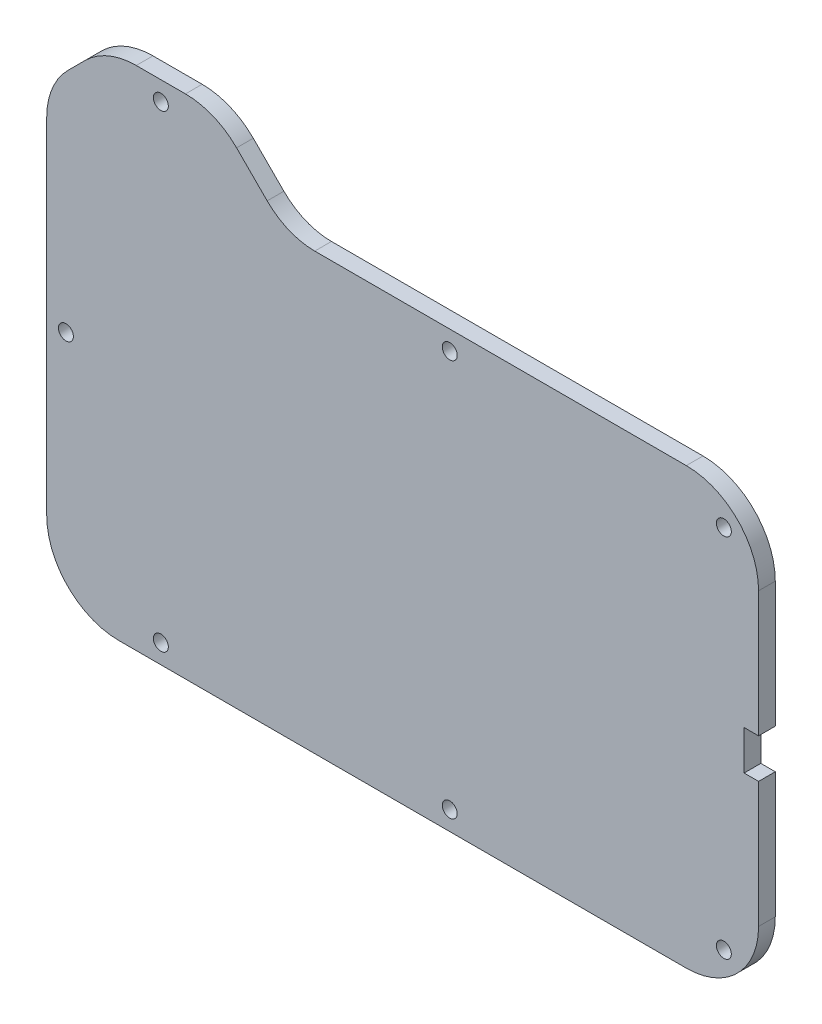
ISO-10303-21;
HEADER;
FILE_DESCRIPTION(('STEP AP214'),'2;1');
FILE_NAME('part.step','',(''),(''),'','','');
FILE_SCHEMA(('AUTOMOTIVE_DESIGN { 1 0 10303 214 1 1 1 1 }'));
ENDSEC;
DATA;
#1=APPLICATION_CONTEXT('core data for automotive mechanical design processes');
#2=APPLICATION_PROTOCOL_DEFINITION('international standard','automotive_design',2000,#1);
#3=PRODUCT_CONTEXT('',#1,'mechanical');
#4=PRODUCT('Part','Part','',(#3));
#5=PRODUCT_RELATED_PRODUCT_CATEGORY('part','',(#4));
#6=PRODUCT_DEFINITION_FORMATION('','',#4);
#7=PRODUCT_DEFINITION_CONTEXT('part definition',#1,'design');
#8=PRODUCT_DEFINITION('design','',#6,#7);
#9=PRODUCT_DEFINITION_SHAPE('','',#8);
#10=(LENGTH_UNIT() NAMED_UNIT(*) SI_UNIT(.MILLI.,.METRE.));
#11=(NAMED_UNIT(*) PLANE_ANGLE_UNIT() SI_UNIT($,.RADIAN.));
#12=(NAMED_UNIT(*) SI_UNIT($,.STERADIAN.) SOLID_ANGLE_UNIT());
#13=UNCERTAINTY_MEASURE_WITH_UNIT(LENGTH_MEASURE(1.E-05),#10,'distance_accuracy_value','');
#14=(GEOMETRIC_REPRESENTATION_CONTEXT(3) GLOBAL_UNCERTAINTY_ASSIGNED_CONTEXT((#13)) GLOBAL_UNIT_ASSIGNED_CONTEXT((#10,
#11,#12)) REPRESENTATION_CONTEXT('',''));
#15=CARTESIAN_POINT('',(0.,0.,0.));
#16=DIRECTION('',(0.,0.,1.));
#17=DIRECTION('',(1.,0.,0.));
#18=AXIS2_PLACEMENT_3D('',#15,#16,#17);
#19=CARTESIAN_POINT('',(130.058069079206,20.4605017386257,3.175));
#20=DIRECTION('',(0.,0.,1.));
#21=DIRECTION('',(1.,0.,0.));
#22=AXIS2_PLACEMENT_3D('',#19,#20,#21);
#23=PLANE('',#22);
#24=CARTESIAN_POINT('',(85.0537427985491,10.3605017396949,3.175));
#25=DIRECTION('',(0.,0.,1.));
#26=DIRECTION('',(1.,0.,0.));
#27=AXIS2_PLACEMENT_3D('',#24,#25,#26);
#28=CIRCLE('',#27,1.425);
#29=CARTESIAN_POINT('',(86.4787427985491,10.3605017396949,3.175));
#30=VERTEX_POINT('',#29);
#31=EDGE_CURVE('E383',#30,#30,#28,.T.);
#32=ORIENTED_EDGE('',*,*,#31,.F.);
#33=EDGE_LOOP('',(#32));
#34=FACE_BOUND('',#33,.T.);
#35=CARTESIAN_POINT('',(137.199847569466,82.9022802294033,3.175));
#36=DIRECTION('',(0.,0.,1.));
#37=DIRECTION('',(1.,0.,0.));
#38=AXIS2_PLACEMENT_3D('',#35,#36,#37);
#39=CIRCLE('',#38,1.42500000000002);
#40=CARTESIAN_POINT('',(138.624847569466,82.9022802294033,3.175));
#41=VERTEX_POINT('',#40);
#42=EDGE_CURVE('E395',#41,#41,#39,.T.);
#43=ORIENTED_EDGE('',*,*,#42,.F.);
#44=EDGE_LOOP('',(#43));
#45=FACE_BOUND('',#44,.T.);
#46=CARTESIAN_POINT('',(30.0963119397805,99.4605017396949,3.175));
#47=DIRECTION('',(0.,0.,1.));
#48=DIRECTION('',(1.,0.,0.));
#49=AXIS2_PLACEMENT_3D('',#46,#47,#48);
#50=CIRCLE('',#49,1.425);
#51=CARTESIAN_POINT('',(31.5213119397805,99.4605017396949,3.175));
#52=VERTEX_POINT('',#51);
#53=EDGE_CURVE('E407',#52,#52,#50,.T.);
#54=ORIENTED_EDGE('',*,*,#53,.F.);
#55=EDGE_LOOP('',(#54));
#56=FACE_BOUND('',#55,.T.);
#57=CARTESIAN_POINT('',(130.058069079206,20.4605017386257,3.175));
#58=DIRECTION('',(0.,0.,1.));
#59=DIRECTION('',(1.,0.,0.));
#60=AXIS2_PLACEMENT_3D('',#57,#58,#59);
#61=CIRCLE('',#60,13.75);
#62=CARTESIAN_POINT('',(130.058069079206,6.71050173862571,3.175));
#63=VERTEX_POINT('',#62);
#64=CARTESIAN_POINT('',(143.808069079206,20.4605017386257,3.175));
#65=VERTEX_POINT('',#64);
#66=EDGE_CURVE('E227',#63,#65,#61,.T.);
#67=ORIENTED_EDGE('',*,*,#66,.T.);
#68=DIRECTION('',(0.,1.,0.));
#69=VECTOR('',#68,1.);
#70=CARTESIAN_POINT('',(143.808069079206,20.4605017386257,3.175));
#71=LINE('',#70,#69);
#72=CARTESIAN_POINT('',(143.808069079206,44.3605017391603,3.175));
#73=VERTEX_POINT('',#72);
#74=EDGE_CURVE('E125',#65,#73,#71,.T.);
#75=ORIENTED_EDGE('',*,*,#74,.T.);
#76=DIRECTION('',(-1.,0.,0.));
#77=VECTOR('',#76,1.);
#78=CARTESIAN_POINT('',(141.058069079206,44.3605017391603,3.175));
#79=LINE('',#78,#77);
#80=CARTESIAN_POINT('',(141.058069079206,44.3605017391603,3.175));
#81=VERTEX_POINT('',#80);
#82=EDGE_CURVE('E272',#73,#81,#79,.T.);
#83=ORIENTED_EDGE('',*,*,#82,.T.);
#84=DIRECTION('',(0.,1.,0.));
#85=VECTOR('',#84,1.);
#86=CARTESIAN_POINT('',(141.058069079206,44.3605017391603,3.175));
#87=LINE('',#86,#85);
#88=CARTESIAN_POINT('',(141.058069079206,51.8605017391603,3.175));
#89=VERTEX_POINT('',#88);
#90=EDGE_CURVE('E291',#81,#89,#87,.T.);
#91=ORIENTED_EDGE('',*,*,#90,.T.);
#92=DIRECTION('',(1.,0.,0.));
#93=VECTOR('',#92,1.);
#94=CARTESIAN_POINT('',(141.058069079206,51.8605017391603,3.175));
#95=LINE('',#94,#93);
#96=CARTESIAN_POINT('',(143.808069079206,51.8605017391603,3.175));
#97=VERTEX_POINT('',#96);
#98=EDGE_CURVE('E288',#89,#97,#95,.T.);
#99=ORIENTED_EDGE('',*,*,#98,.T.);
#100=DIRECTION('',(0.,1.,0.));
#101=VECTOR('',#100,1.);
#102=CARTESIAN_POINT('',(143.808069079206,51.8605017391603,3.175));
#103=LINE('',#102,#101);
#104=CARTESIAN_POINT('',(143.808069079206,75.7605017396949,3.175));
#105=VERTEX_POINT('',#104);
#106=EDGE_CURVE('E290',#97,#105,#103,.T.);
#107=ORIENTED_EDGE('',*,*,#106,.T.);
#108=CARTESIAN_POINT('',(130.058069079206,75.7605017396949,3.175));
#109=DIRECTION('',(0.,0.,1.));
#110=DIRECTION('',(1.,0.,0.));
#111=AXIS2_PLACEMENT_3D('',#108,#109,#110);
#112=CIRCLE('',#111,13.75);
#113=CARTESIAN_POINT('',(130.058069079206,89.5105017396949,3.175));
#114=VERTEX_POINT('',#113);
#115=EDGE_CURVE('E293',#105,#114,#112,.T.);
#116=ORIENTED_EDGE('',*,*,#115,.T.);
#117=DIRECTION('',(-1.,0.,0.));
#118=VECTOR('',#117,1.);
#119=CARTESIAN_POINT('',(130.058069079206,89.5105017396948,3.175));
#120=LINE('',#119,#118);
#121=CARTESIAN_POINT('',(59.3751830391429,89.5105017396948,3.175));
#122=VERTEX_POINT('',#121);
#123=EDGE_CURVE('E299',#114,#122,#120,.T.);
#124=ORIENTED_EDGE('',*,*,#123,.T.);
#125=CARTESIAN_POINT('',(59.3751830391429,102.310501739695,3.175));
#126=DIRECTION('',(0.,0.,-1.));
#127=DIRECTION('',(1.,0.,0.));
#128=AXIS2_PLACEMENT_3D('',#125,#126,#127);
#129=CIRCLE('',#128,12.8);
#130=CARTESIAN_POINT('',(50.3242162399551,93.2595349405071,3.175));
#131=VERTEX_POINT('',#130);
#132=EDGE_CURVE('E301',#122,#131,#129,.T.);
#133=ORIENTED_EDGE('',*,*,#132,.T.);
#134=DIRECTION('',(-0.707106781186548,0.707106781186548,0.));
#135=VECTOR('',#134,1.);
#136=CARTESIAN_POINT('',(50.3242162399551,93.2595349405071,3.175));
#137=LINE('',#136,#135);
#138=CARTESIAN_POINT('',(44.5005311994522,99.0832199810099,3.175));
#139=VERTEX_POINT('',#138);
#140=EDGE_CURVE('E303',#131,#139,#137,.T.);
#141=ORIENTED_EDGE('',*,*,#140,.T.);
#142=CARTESIAN_POINT('',(34.7778129581372,89.3605017396949,3.175));
#143=DIRECTION('',(0.,0.,1.));
#144=DIRECTION('',(1.,0.,0.));
#145=AXIS2_PLACEMENT_3D('',#142,#143,#144);
#146=CIRCLE('',#145,13.75);
#147=CARTESIAN_POINT('',(34.7778129581371,103.110501739695,3.175));
#148=VERTEX_POINT('',#147);
#149=EDGE_CURVE('E305',#139,#148,#146,.T.);
#150=ORIENTED_EDGE('',*,*,#149,.T.);
#151=DIRECTION('',(-1.,0.,0.));
#152=VECTOR('',#151,1.);
#153=CARTESIAN_POINT('',(34.7778129581371,103.110501739695,3.175));
#154=LINE('',#153,#152);
#155=CARTESIAN_POINT('',(25.4148109214239,103.110501739695,3.175));
#156=VERTEX_POINT('',#155);
#157=EDGE_CURVE('E307',#148,#156,#154,.T.);
#158=ORIENTED_EDGE('',*,*,#157,.T.);
#159=CARTESIAN_POINT('',(25.4148109214239,89.3605017396949,3.175));
#160=DIRECTION('',(0.,0.,1.));
#161=DIRECTION('',(1.,0.,0.));
#162=AXIS2_PLACEMENT_3D('',#159,#160,#161);
#163=CIRCLE('',#162,13.75);
#164=CARTESIAN_POINT('',(15.6920926801088,99.0832199810099,3.175));
#165=VERTEX_POINT('',#164);
#166=EDGE_CURVE('E309',#156,#165,#163,.T.);
#167=ORIENTED_EDGE('',*,*,#166,.T.);
#168=DIRECTION('',(-0.707106781186548,-0.707106781186548,0.));
#169=VECTOR('',#168,1.);
#170=CARTESIAN_POINT('',(15.6920926801088,99.0832199810099,3.175));
#171=LINE('',#170,#169);
#172=CARTESIAN_POINT('',(12.4118365590397,95.8029638599407,3.175));
#173=VERTEX_POINT('',#172);
#174=EDGE_CURVE('E311',#165,#173,#171,.T.);
#175=ORIENTED_EDGE('',*,*,#174,.T.);
#176=CARTESIAN_POINT('',(22.1345548003547,86.0802456186257,3.175));
#177=DIRECTION('',(0.,0.,1.));
#178=DIRECTION('',(1.,0.,0.));
#179=AXIS2_PLACEMENT_3D('',#176,#177,#178);
#180=CIRCLE('',#179,13.75);
#181=CARTESIAN_POINT('',(8.38455480035474,86.0802456186257,3.175));
#182=VERTEX_POINT('',#181);
#183=EDGE_CURVE('E174',#173,#182,#180,.T.);
#184=ORIENTED_EDGE('',*,*,#183,.T.);
#185=DIRECTION('',(0.,-1.,0.));
#186=VECTOR('',#185,1.);
#187=CARTESIAN_POINT('',(8.38455480035474,86.0802456186257,3.175));
#188=LINE('',#187,#186);
#189=CARTESIAN_POINT('',(8.38455480035472,20.4605017386257,3.175));
#190=VERTEX_POINT('',#189);
#191=EDGE_CURVE('E168',#182,#190,#188,.T.);
#192=ORIENTED_EDGE('',*,*,#191,.T.);
#193=CARTESIAN_POINT('',(22.1345548003547,20.4605017386257,3.175));
#194=DIRECTION('',(0.,0.,1.));
#195=DIRECTION('',(1.,0.,0.));
#196=AXIS2_PLACEMENT_3D('',#193,#194,#195);
#197=CIRCLE('',#196,13.75);
#198=CARTESIAN_POINT('',(22.1345548003547,6.7105017386257,3.175));
#199=VERTEX_POINT('',#198);
#200=EDGE_CURVE('E172',#190,#199,#197,.T.);
#201=ORIENTED_EDGE('',*,*,#200,.T.);
#202=DIRECTION('',(1.,0.,0.));
#203=VECTOR('',#202,1.);
#204=CARTESIAN_POINT('',(22.1345548003547,6.71050173862571,3.175));
#205=LINE('',#204,#203);
#206=EDGE_CURVE('E52',#199,#63,#205,.T.);
#207=ORIENTED_EDGE('',*,*,#206,.T.);
#208=EDGE_LOOP('',(#67,#75,#83,#91,#99,#107,#116,#124,#133,#141,#150,#158,#167,#175,#184,#192,
#201,#207));
#209=FACE_BOUND('',#208,.T.);
#210=CARTESIAN_POINT('',(12.0345548003547,52.4703736791603,3.175));
#211=DIRECTION('',(0.,0.,1.));
#212=DIRECTION('',(1.,0.,0.));
#213=AXIS2_PLACEMENT_3D('',#210,#211,#212);
#214=CIRCLE('',#213,1.425);
#215=CARTESIAN_POINT('',(13.4595548003547,52.4703736791603,3.175));
#216=VERTEX_POINT('',#215);
#217=EDGE_CURVE('E196',#216,#216,#214,.T.);
#218=ORIENTED_EDGE('',*,*,#217,.F.);
#219=EDGE_LOOP('',(#218));
#220=FACE_BOUND('',#219,.T.);
#221=CARTESIAN_POINT('',(85.0537427985491,85.8605017396949,3.175));
#222=DIRECTION('',(0.,0.,1.));
#223=DIRECTION('',(1.,0.,0.));
#224=AXIS2_PLACEMENT_3D('',#221,#222,#223);
#225=CIRCLE('',#224,1.425);
#226=CARTESIAN_POINT('',(86.4787427985491,85.8605017396949,3.175));
#227=VERTEX_POINT('',#226);
#228=EDGE_CURVE('E401',#227,#227,#225,.T.);
#229=ORIENTED_EDGE('',*,*,#228,.F.);
#230=EDGE_LOOP('',(#229));
#231=FACE_BOUND('',#230,.T.);
#232=CARTESIAN_POINT('',(137.199847569458,13.3187232494434,3.175));
#233=DIRECTION('',(0.,0.,1.));
#234=DIRECTION('',(1.,0.,0.));
#235=AXIS2_PLACEMENT_3D('',#232,#233,#234);
#236=CIRCLE('',#235,1.42500000000002);
#237=CARTESIAN_POINT('',(138.624847569458,13.3187232494434,3.175));
#238=VERTEX_POINT('',#237);
#239=EDGE_CURVE('E389',#238,#238,#236,.T.);
#240=ORIENTED_EDGE('',*,*,#239,.F.);
#241=EDGE_LOOP('',(#240));
#242=FACE_BOUND('',#241,.T.);
#243=CARTESIAN_POINT('',(30.0963119397805,10.3605017396949,3.175));
#244=DIRECTION('',(0.,0.,1.));
#245=DIRECTION('',(1.,0.,0.));
#246=AXIS2_PLACEMENT_3D('',#243,#244,#245);
#247=CIRCLE('',#246,1.425);
#248=CARTESIAN_POINT('',(31.5213119397805,10.3605017396949,3.175));
#249=VERTEX_POINT('',#248);
#250=EDGE_CURVE('E374',#249,#249,#247,.T.);
#251=ORIENTED_EDGE('',*,*,#250,.F.);
#252=EDGE_LOOP('',(#251));
#253=FACE_BOUND('',#252,.T.);
#254=ADVANCED_FACE('F35',(#34,#45,#56,#209,#220,#231,#242,#253),#23,.T.);
#255=CARTESIAN_POINT('',(130.058069079206,20.4605017386257,0.));
#256=DIRECTION('',(0.,0.,1.));
#257=DIRECTION('',(1.,0.,0.));
#258=AXIS2_PLACEMENT_3D('',#255,#256,#257);
#259=PLANE('',#258);
#260=CARTESIAN_POINT('',(130.058069079206,20.4605017386257,0.));
#261=DIRECTION('',(0.,0.,1.));
#262=DIRECTION('',(1.,0.,0.));
#263=AXIS2_PLACEMENT_3D('',#260,#261,#262);
#264=CIRCLE('',#263,13.75);
#265=CARTESIAN_POINT('',(130.058069079206,6.71050173862571,0.));
#266=VERTEX_POINT('',#265);
#267=CARTESIAN_POINT('',(143.808069079206,20.4605017386257,0.));
#268=VERTEX_POINT('',#267);
#269=EDGE_CURVE('E192',#266,#268,#264,.T.);
#270=ORIENTED_EDGE('',*,*,#269,.F.);
#271=DIRECTION('',(1.,0.,0.));
#272=VECTOR('',#271,1.);
#273=CARTESIAN_POINT('',(22.1345548003547,6.71050173862571,0.));
#274=LINE('',#273,#272);
#275=CARTESIAN_POINT('',(22.1345548003547,6.7105017386257,0.));
#276=VERTEX_POINT('',#275);
#277=EDGE_CURVE('E117',#276,#266,#274,.T.);
#278=ORIENTED_EDGE('',*,*,#277,.F.);
#279=CARTESIAN_POINT('',(22.1345548003547,20.4605017386257,0.));
#280=DIRECTION('',(0.,0.,1.));
#281=DIRECTION('',(1.,0.,0.));
#282=AXIS2_PLACEMENT_3D('',#279,#280,#281);
#283=CIRCLE('',#282,13.75);
#284=CARTESIAN_POINT('',(8.38455480035472,20.4605017386257,0.));
#285=VERTEX_POINT('',#284);
#286=EDGE_CURVE('E111',#285,#276,#283,.T.);
#287=ORIENTED_EDGE('',*,*,#286,.F.);
#288=DIRECTION('',(0.,-1.,0.));
#289=VECTOR('',#288,1.);
#290=CARTESIAN_POINT('',(8.38455480035474,86.0802456186257,0.));
#291=LINE('',#290,#289);
#292=CARTESIAN_POINT('',(8.38455480035474,86.0802456186257,0.));
#293=VERTEX_POINT('',#292);
#294=EDGE_CURVE('E182',#293,#285,#291,.T.);
#295=ORIENTED_EDGE('',*,*,#294,.F.);
#296=CARTESIAN_POINT('',(22.1345548003547,86.0802456186257,0.));
#297=DIRECTION('',(0.,0.,1.));
#298=DIRECTION('',(1.,0.,0.));
#299=AXIS2_PLACEMENT_3D('',#296,#297,#298);
#300=CIRCLE('',#299,13.75);
#301=CARTESIAN_POINT('',(12.4118365590397,95.8029638599407,0.));
#302=VERTEX_POINT('',#301);
#303=EDGE_CURVE('E222',#302,#293,#300,.T.);
#304=ORIENTED_EDGE('',*,*,#303,.F.);
#305=DIRECTION('',(-0.707106781186548,-0.707106781186548,0.));
#306=VECTOR('',#305,1.);
#307=CARTESIAN_POINT('',(15.6920926801088,99.0832199810099,0.));
#308=LINE('',#307,#306);
#309=CARTESIAN_POINT('',(15.6920926801088,99.0832199810099,0.));
#310=VERTEX_POINT('',#309);
#311=EDGE_CURVE('E220',#310,#302,#308,.T.);
#312=ORIENTED_EDGE('',*,*,#311,.F.);
#313=CARTESIAN_POINT('',(25.4148109214239,89.3605017396949,0.));
#314=DIRECTION('',(0.,0.,1.));
#315=DIRECTION('',(1.,0.,0.));
#316=AXIS2_PLACEMENT_3D('',#313,#314,#315);
#317=CIRCLE('',#316,13.75);
#318=CARTESIAN_POINT('',(25.4148109214239,103.110501739695,0.));
#319=VERTEX_POINT('',#318);
#320=EDGE_CURVE('E218',#319,#310,#317,.T.);
#321=ORIENTED_EDGE('',*,*,#320,.F.);
#322=DIRECTION('',(-1.,0.,0.));
#323=VECTOR('',#322,1.);
#324=CARTESIAN_POINT('',(34.7778129581371,103.110501739695,0.));
#325=LINE('',#324,#323);
#326=CARTESIAN_POINT('',(34.7778129581371,103.110501739695,0.));
#327=VERTEX_POINT('',#326);
#328=EDGE_CURVE('E216',#327,#319,#325,.T.);
#329=ORIENTED_EDGE('',*,*,#328,.F.);
#330=CARTESIAN_POINT('',(34.7778129581372,89.3605017396949,0.));
#331=DIRECTION('',(0.,0.,1.));
#332=DIRECTION('',(1.,0.,0.));
#333=AXIS2_PLACEMENT_3D('',#330,#331,#332);
#334=CIRCLE('',#333,13.75);
#335=CARTESIAN_POINT('',(44.5005311994522,99.0832199810099,0.));
#336=VERTEX_POINT('',#335);
#337=EDGE_CURVE('E214',#336,#327,#334,.T.);
#338=ORIENTED_EDGE('',*,*,#337,.F.);
#339=DIRECTION('',(-0.707106781186548,0.707106781186548,0.));
#340=VECTOR('',#339,1.);
#341=CARTESIAN_POINT('',(50.3242162399551,93.2595349405071,0.));
#342=LINE('',#341,#340);
#343=CARTESIAN_POINT('',(50.3242162399551,93.2595349405071,0.));
#344=VERTEX_POINT('',#343);
#345=EDGE_CURVE('E212',#344,#336,#342,.T.);
#346=ORIENTED_EDGE('',*,*,#345,.F.);
#347=CARTESIAN_POINT('',(59.3751830391429,102.310501739695,0.));
#348=DIRECTION('',(0.,0.,-1.));
#349=DIRECTION('',(1.,0.,0.));
#350=AXIS2_PLACEMENT_3D('',#347,#348,#349);
#351=CIRCLE('',#350,12.8);
#352=CARTESIAN_POINT('',(59.3751830391429,89.5105017396948,0.));
#353=VERTEX_POINT('',#352);
#354=EDGE_CURVE('E210',#353,#344,#351,.T.);
#355=ORIENTED_EDGE('',*,*,#354,.F.);
#356=DIRECTION('',(-1.,0.,0.));
#357=VECTOR('',#356,1.);
#358=CARTESIAN_POINT('',(130.058069079206,89.5105017396948,0.));
#359=LINE('',#358,#357);
#360=CARTESIAN_POINT('',(130.058069079206,89.5105017396949,0.));
#361=VERTEX_POINT('',#360);
#362=EDGE_CURVE('E208',#361,#353,#359,.T.);
#363=ORIENTED_EDGE('',*,*,#362,.F.);
#364=CARTESIAN_POINT('',(130.058069079206,75.7605017396949,0.));
#365=DIRECTION('',(0.,0.,1.));
#366=DIRECTION('',(1.,0.,0.));
#367=AXIS2_PLACEMENT_3D('',#364,#365,#366);
#368=CIRCLE('',#367,13.75);
#369=CARTESIAN_POINT('',(143.808069079206,75.7605017396949,0.));
#370=VERTEX_POINT('',#369);
#371=EDGE_CURVE('E206',#370,#361,#368,.T.);
#372=ORIENTED_EDGE('',*,*,#371,.F.);
#373=DIRECTION('',(0.,1.,0.));
#374=VECTOR('',#373,1.);
#375=CARTESIAN_POINT('',(143.808069079206,51.8605017391603,0.));
#376=LINE('',#375,#374);
#377=CARTESIAN_POINT('',(143.808069079206,51.8605017391603,0.));
#378=VERTEX_POINT('',#377);
#379=EDGE_CURVE('E204',#378,#370,#376,.T.);
#380=ORIENTED_EDGE('',*,*,#379,.F.);
#381=DIRECTION('',(1.,0.,0.));
#382=VECTOR('',#381,1.);
#383=CARTESIAN_POINT('',(141.058069079206,51.8605017391603,0.));
#384=LINE('',#383,#382);
#385=CARTESIAN_POINT('',(141.058069079206,51.8605017391603,0.));
#386=VERTEX_POINT('',#385);
#387=EDGE_CURVE('E202',#386,#378,#384,.T.);
#388=ORIENTED_EDGE('',*,*,#387,.F.);
#389=DIRECTION('',(0.,1.,0.));
#390=VECTOR('',#389,1.);
#391=CARTESIAN_POINT('',(141.058069079206,44.3605017391603,0.));
#392=LINE('',#391,#390);
#393=CARTESIAN_POINT('',(141.058069079206,44.3605017391603,0.));
#394=VERTEX_POINT('',#393);
#395=EDGE_CURVE('E200',#394,#386,#392,.T.);
#396=ORIENTED_EDGE('',*,*,#395,.F.);
#397=DIRECTION('',(-1.,0.,0.));
#398=VECTOR('',#397,1.);
#399=CARTESIAN_POINT('',(141.058069079206,44.3605017391603,0.));
#400=LINE('',#399,#398);
#401=CARTESIAN_POINT('',(143.808069079206,44.3605017391603,0.));
#402=VERTEX_POINT('',#401);
#403=EDGE_CURVE('E198',#402,#394,#400,.T.);
#404=ORIENTED_EDGE('',*,*,#403,.F.);
#405=DIRECTION('',(0.,1.,0.));
#406=VECTOR('',#405,1.);
#407=CARTESIAN_POINT('',(143.808069079206,20.4605017386257,0.));
#408=LINE('',#407,#406);
#409=EDGE_CURVE('E195',#268,#402,#408,.T.);
#410=ORIENTED_EDGE('',*,*,#409,.F.);
#411=EDGE_LOOP('',(#270,#278,#287,#295,#304,#312,#321,#329,#338,#346,#355,#363,#372,#380,#388,
#396,#404,#410));
#412=FACE_BOUND('',#411,.T.);
#413=CARTESIAN_POINT('',(12.0345548003547,52.4703736791603,0.));
#414=DIRECTION('',(0.,0.,1.));
#415=DIRECTION('',(1.,0.,0.));
#416=AXIS2_PLACEMENT_3D('',#413,#414,#415);
#417=CIRCLE('',#416,1.425);
#418=CARTESIAN_POINT('',(13.4595548003547,52.4703736791603,0.));
#419=VERTEX_POINT('',#418);
#420=EDGE_CURVE('E410',#419,#419,#417,.T.);
#421=ORIENTED_EDGE('',*,*,#420,.T.);
#422=EDGE_LOOP('',(#421));
#423=FACE_BOUND('',#422,.T.);
#424=CARTESIAN_POINT('',(30.0963119397805,99.4605017396949,0.));
#425=DIRECTION('',(0.,0.,1.));
#426=DIRECTION('',(1.,0.,0.));
#427=AXIS2_PLACEMENT_3D('',#424,#425,#426);
#428=CIRCLE('',#427,1.425);
#429=CARTESIAN_POINT('',(31.5213119397805,99.4605017396949,0.));
#430=VERTEX_POINT('',#429);
#431=EDGE_CURVE('E404',#430,#430,#428,.T.);
#432=ORIENTED_EDGE('',*,*,#431,.T.);
#433=EDGE_LOOP('',(#432));
#434=FACE_BOUND('',#433,.T.);
#435=CARTESIAN_POINT('',(85.0537427985491,85.8605017396949,0.));
#436=DIRECTION('',(0.,0.,1.));
#437=DIRECTION('',(1.,0.,0.));
#438=AXIS2_PLACEMENT_3D('',#435,#436,#437);
#439=CIRCLE('',#438,1.425);
#440=CARTESIAN_POINT('',(86.4787427985491,85.8605017396949,0.));
#441=VERTEX_POINT('',#440);
#442=EDGE_CURVE('E398',#441,#441,#439,.T.);
#443=ORIENTED_EDGE('',*,*,#442,.T.);
#444=EDGE_LOOP('',(#443));
#445=FACE_BOUND('',#444,.T.);
#446=CARTESIAN_POINT('',(137.199847569466,82.9022802294033,0.));
#447=DIRECTION('',(0.,0.,1.));
#448=DIRECTION('',(1.,0.,0.));
#449=AXIS2_PLACEMENT_3D('',#446,#447,#448);
#450=CIRCLE('',#449,1.42500000000002);
#451=CARTESIAN_POINT('',(138.624847569466,82.9022802294033,0.));
#452=VERTEX_POINT('',#451);
#453=EDGE_CURVE('E392',#452,#452,#450,.T.);
#454=ORIENTED_EDGE('',*,*,#453,.T.);
#455=EDGE_LOOP('',(#454));
#456=FACE_BOUND('',#455,.T.);
#457=CARTESIAN_POINT('',(137.199847569458,13.3187232494434,0.));
#458=DIRECTION('',(0.,0.,1.));
#459=DIRECTION('',(1.,0.,0.));
#460=AXIS2_PLACEMENT_3D('',#457,#458,#459);
#461=CIRCLE('',#460,1.42500000000002);
#462=CARTESIAN_POINT('',(138.624847569458,13.3187232494434,0.));
#463=VERTEX_POINT('',#462);
#464=EDGE_CURVE('E386',#463,#463,#461,.T.);
#465=ORIENTED_EDGE('',*,*,#464,.T.);
#466=EDGE_LOOP('',(#465));
#467=FACE_BOUND('',#466,.T.);
#468=CARTESIAN_POINT('',(85.0537427985491,10.3605017396949,0.));
#469=DIRECTION('',(0.,0.,1.));
#470=DIRECTION('',(1.,0.,0.));
#471=AXIS2_PLACEMENT_3D('',#468,#469,#470);
#472=CIRCLE('',#471,1.425);
#473=CARTESIAN_POINT('',(86.4787427985491,10.3605017396949,0.));
#474=VERTEX_POINT('',#473);
#475=EDGE_CURVE('E380',#474,#474,#472,.T.);
#476=ORIENTED_EDGE('',*,*,#475,.T.);
#477=EDGE_LOOP('',(#476));
#478=FACE_BOUND('',#477,.T.);
#479=CARTESIAN_POINT('',(30.0963119397805,10.3605017396949,0.));
#480=DIRECTION('',(0.,0.,1.));
#481=DIRECTION('',(1.,0.,0.));
#482=AXIS2_PLACEMENT_3D('',#479,#480,#481);
#483=CIRCLE('',#482,1.425);
#484=CARTESIAN_POINT('',(31.5213119397805,10.3605017396949,0.));
#485=VERTEX_POINT('',#484);
#486=EDGE_CURVE('E377',#485,#485,#483,.T.);
#487=ORIENTED_EDGE('',*,*,#486,.T.);
#488=EDGE_LOOP('',(#487));
#489=FACE_BOUND('',#488,.T.);
#490=ADVANCED_FACE('F276',(#412,#423,#434,#445,#456,#467,#478,#489),#259,.F.);
#491=CARTESIAN_POINT('',(130.058069079206,20.4605017386257,3.175));
#492=DIRECTION('',(0.,0.,-1.));
#493=DIRECTION('',(-1.,0.,0.));
#494=AXIS2_PLACEMENT_3D('',#491,#492,#493);
#495=CYLINDRICAL_SURFACE('',#494,13.75);
#496=ORIENTED_EDGE('',*,*,#269,.T.);
#497=DIRECTION('',(0.,0.,-1.));
#498=VECTOR('',#497,1.);
#499=CARTESIAN_POINT('',(143.808069079206,20.4605017386257,3.175));
#500=LINE('',#499,#498);
#501=EDGE_CURVE('E11',#65,#268,#500,.T.);
#502=ORIENTED_EDGE('',*,*,#501,.F.);
#503=ORIENTED_EDGE('',*,*,#66,.F.);
#504=DIRECTION('',(0.,0.,-1.));
#505=VECTOR('',#504,1.);
#506=CARTESIAN_POINT('',(130.058069079206,6.71050173862571,3.175));
#507=LINE('',#506,#505);
#508=EDGE_CURVE('E188',#63,#266,#507,.T.);
#509=ORIENTED_EDGE('',*,*,#508,.T.);
#510=EDGE_LOOP('',(#496,#502,#503,#509));
#511=FACE_BOUND('',#510,.T.);
#512=ADVANCED_FACE('F37',(#511),#495,.T.);
#513=CARTESIAN_POINT('',(143.808069079206,20.4605017386257,3.175));
#514=DIRECTION('',(-1.,0.,0.));
#515=DIRECTION('',(0.,0.,1.));
#516=AXIS2_PLACEMENT_3D('',#513,#514,#515);
#517=PLANE('',#516);
#518=ORIENTED_EDGE('',*,*,#409,.T.);
#519=DIRECTION('',(0.,0.,-1.));
#520=VECTOR('',#519,1.);
#521=CARTESIAN_POINT('',(143.808069079206,44.3605017391603,3.175));
#522=LINE('',#521,#520);
#523=EDGE_CURVE('E44',#73,#402,#522,.T.);
#524=ORIENTED_EDGE('',*,*,#523,.F.);
#525=ORIENTED_EDGE('',*,*,#74,.F.);
#526=ORIENTED_EDGE('',*,*,#501,.T.);
#527=EDGE_LOOP('',(#518,#524,#525,#526));
#528=FACE_BOUND('',#527,.T.);
#529=ADVANCED_FACE('F607',(#528),#517,.F.);
#530=CARTESIAN_POINT('',(141.058069079206,44.3605017391603,3.175));
#531=DIRECTION('',(0.,-1.,0.));
#532=DIRECTION('',(0.,0.,-1.));
#533=AXIS2_PLACEMENT_3D('',#530,#531,#532);
#534=PLANE('',#533);
#535=ORIENTED_EDGE('',*,*,#403,.T.);
#536=DIRECTION('',(0.,0.,-1.));
#537=VECTOR('',#536,1.);
#538=CARTESIAN_POINT('',(141.058069079206,44.3605017391603,3.175));
#539=LINE('',#538,#537);
#540=EDGE_CURVE('E264',#81,#394,#539,.T.);
#541=ORIENTED_EDGE('',*,*,#540,.F.);
#542=ORIENTED_EDGE('',*,*,#82,.F.);
#543=ORIENTED_EDGE('',*,*,#523,.T.);
#544=EDGE_LOOP('',(#535,#541,#542,#543));
#545=FACE_BOUND('',#544,.T.);
#546=ADVANCED_FACE('F270',(#545),#534,.F.);
#547=CARTESIAN_POINT('',(141.058069079206,44.3605017391603,3.175));
#548=DIRECTION('',(-1.,0.,0.));
#549=DIRECTION('',(0.,0.,1.));
#550=AXIS2_PLACEMENT_3D('',#547,#548,#549);
#551=PLANE('',#550);
#552=ORIENTED_EDGE('',*,*,#395,.T.);
#553=DIRECTION('',(0.,0.,-1.));
#554=VECTOR('',#553,1.);
#555=CARTESIAN_POINT('',(141.058069079206,51.8605017391603,3.175));
#556=LINE('',#555,#554);
#557=EDGE_CURVE('E261',#89,#386,#556,.T.);
#558=ORIENTED_EDGE('',*,*,#557,.F.);
#559=ORIENTED_EDGE('',*,*,#90,.F.);
#560=ORIENTED_EDGE('',*,*,#540,.T.);
#561=EDGE_LOOP('',(#552,#558,#559,#560));
#562=FACE_BOUND('',#561,.T.);
#563=ADVANCED_FACE('F282',(#562),#551,.F.);
#564=CARTESIAN_POINT('',(141.058069079206,51.8605017391603,3.175));
#565=DIRECTION('',(0.,1.,0.));
#566=DIRECTION('',(0.,0.,1.));
#567=AXIS2_PLACEMENT_3D('',#564,#565,#566);
#568=PLANE('',#567);
#569=ORIENTED_EDGE('',*,*,#387,.T.);
#570=DIRECTION('',(0.,0.,-1.));
#571=VECTOR('',#570,1.);
#572=CARTESIAN_POINT('',(143.808069079206,51.8605017391603,3.175));
#573=LINE('',#572,#571);
#574=EDGE_CURVE('E258',#97,#378,#573,.T.);
#575=ORIENTED_EDGE('',*,*,#574,.F.);
#576=ORIENTED_EDGE('',*,*,#98,.F.);
#577=ORIENTED_EDGE('',*,*,#557,.T.);
#578=EDGE_LOOP('',(#569,#575,#576,#577));
#579=FACE_BOUND('',#578,.T.);
#580=ADVANCED_FACE('F286',(#579),#568,.F.);
#581=CARTESIAN_POINT('',(143.808069079206,51.8605017391603,3.175));
#582=DIRECTION('',(-1.,0.,0.));
#583=DIRECTION('',(0.,0.,1.));
#584=AXIS2_PLACEMENT_3D('',#581,#582,#583);
#585=PLANE('',#584);
#586=ORIENTED_EDGE('',*,*,#379,.T.);
#587=DIRECTION('',(0.,0.,-1.));
#588=VECTOR('',#587,1.);
#589=CARTESIAN_POINT('',(143.808069079206,75.7605017396949,3.175));
#590=LINE('',#589,#588);
#591=EDGE_CURVE('E255',#105,#370,#590,.T.);
#592=ORIENTED_EDGE('',*,*,#591,.F.);
#593=ORIENTED_EDGE('',*,*,#106,.F.);
#594=ORIENTED_EDGE('',*,*,#574,.T.);
#595=EDGE_LOOP('',(#586,#592,#593,#594));
#596=FACE_BOUND('',#595,.T.);
#597=ADVANCED_FACE('F572',(#596),#585,.F.);
#598=CARTESIAN_POINT('',(130.058069079206,75.7605017396949,3.175));
#599=DIRECTION('',(0.,0.,-1.));
#600=DIRECTION('',(-1.,0.,0.));
#601=AXIS2_PLACEMENT_3D('',#598,#599,#600);
#602=CYLINDRICAL_SURFACE('',#601,13.75);
#603=ORIENTED_EDGE('',*,*,#371,.T.);
#604=DIRECTION('',(0.,0.,-1.));
#605=VECTOR('',#604,1.);
#606=CARTESIAN_POINT('',(130.058069079206,89.5105017396949,3.175));
#607=LINE('',#606,#605);
#608=EDGE_CURVE('E252',#114,#361,#607,.T.);
#609=ORIENTED_EDGE('',*,*,#608,.F.);
#610=ORIENTED_EDGE('',*,*,#115,.F.);
#611=ORIENTED_EDGE('',*,*,#591,.T.);
#612=EDGE_LOOP('',(#603,#609,#610,#611));
#613=FACE_BOUND('',#612,.T.);
#614=ADVANCED_FACE('F562',(#613),#602,.T.);
#615=CARTESIAN_POINT('',(130.058069079206,89.5105017396948,3.175));
#616=DIRECTION('',(0.,-1.,0.));
#617=DIRECTION('',(0.,0.,-1.));
#618=AXIS2_PLACEMENT_3D('',#615,#616,#617);
#619=PLANE('',#618);
#620=ORIENTED_EDGE('',*,*,#362,.T.);
#621=DIRECTION('',(0.,0.,-1.));
#622=VECTOR('',#621,1.);
#623=CARTESIAN_POINT('',(59.3751830391429,89.5105017396948,3.175));
#624=LINE('',#623,#622);
#625=EDGE_CURVE('E249',#122,#353,#624,.T.);
#626=ORIENTED_EDGE('',*,*,#625,.F.);
#627=ORIENTED_EDGE('',*,*,#123,.F.);
#628=ORIENTED_EDGE('',*,*,#608,.T.);
#629=EDGE_LOOP('',(#620,#626,#627,#628));
#630=FACE_BOUND('',#629,.T.);
#631=ADVANCED_FACE('F552',(#630),#619,.F.);
#632=CARTESIAN_POINT('',(59.3751830391429,102.310501739695,3.175));
#633=DIRECTION('',(0.,0.,-1.));
#634=DIRECTION('',(-1.,0.,0.));
#635=AXIS2_PLACEMENT_3D('',#632,#633,#634);
#636=CYLINDRICAL_SURFACE('',#635,12.8);
#637=ORIENTED_EDGE('',*,*,#354,.T.);
#638=DIRECTION('',(0.,0.,-1.));
#639=VECTOR('',#638,1.);
#640=CARTESIAN_POINT('',(50.3242162399551,93.2595349405071,3.175));
#641=LINE('',#640,#639);
#642=EDGE_CURVE('E246',#131,#344,#641,.T.);
#643=ORIENTED_EDGE('',*,*,#642,.F.);
#644=ORIENTED_EDGE('',*,*,#132,.F.);
#645=ORIENTED_EDGE('',*,*,#625,.T.);
#646=EDGE_LOOP('',(#637,#643,#644,#645));
#647=FACE_BOUND('',#646,.T.);
#648=ADVANCED_FACE('F542',(#647),#636,.F.);
#649=CARTESIAN_POINT('',(50.3242162399551,93.2595349405071,3.175));
#650=DIRECTION('',(-0.707106781186548,-0.707106781186548,0.));
#651=DIRECTION('',(0.707106781186548,-0.707106781186548,0.));
#652=AXIS2_PLACEMENT_3D('',#649,#650,#651);
#653=PLANE('',#652);
#654=ORIENTED_EDGE('',*,*,#345,.T.);
#655=DIRECTION('',(0.,0.,-1.));
#656=VECTOR('',#655,1.);
#657=CARTESIAN_POINT('',(44.5005311994522,99.0832199810099,3.175));
#658=LINE('',#657,#656);
#659=EDGE_CURVE('E243',#139,#336,#658,.T.);
#660=ORIENTED_EDGE('',*,*,#659,.F.);
#661=ORIENTED_EDGE('',*,*,#140,.F.);
#662=ORIENTED_EDGE('',*,*,#642,.T.);
#663=EDGE_LOOP('',(#654,#660,#661,#662));
#664=FACE_BOUND('',#663,.T.);
#665=ADVANCED_FACE('F532',(#664),#653,.F.);
#666=CARTESIAN_POINT('',(34.7778129581372,89.3605017396949,3.175));
#667=DIRECTION('',(0.,0.,-1.));
#668=DIRECTION('',(-1.,0.,0.));
#669=AXIS2_PLACEMENT_3D('',#666,#667,#668);
#670=CYLINDRICAL_SURFACE('',#669,13.75);
#671=ORIENTED_EDGE('',*,*,#337,.T.);
#672=DIRECTION('',(0.,0.,-1.));
#673=VECTOR('',#672,1.);
#674=CARTESIAN_POINT('',(34.7778129581371,103.110501739695,3.175));
#675=LINE('',#674,#673);
#676=EDGE_CURVE('E240',#148,#327,#675,.T.);
#677=ORIENTED_EDGE('',*,*,#676,.F.);
#678=ORIENTED_EDGE('',*,*,#149,.F.);
#679=ORIENTED_EDGE('',*,*,#659,.T.);
#680=EDGE_LOOP('',(#671,#677,#678,#679));
#681=FACE_BOUND('',#680,.T.);
#682=ADVANCED_FACE('F522',(#681),#670,.T.);
#683=CARTESIAN_POINT('',(34.7778129581371,103.110501739695,3.175));
#684=DIRECTION('',(0.,-1.,0.));
#685=DIRECTION('',(0.,0.,-1.));
#686=AXIS2_PLACEMENT_3D('',#683,#684,#685);
#687=PLANE('',#686);
#688=ORIENTED_EDGE('',*,*,#328,.T.);
#689=DIRECTION('',(0.,0.,-1.));
#690=VECTOR('',#689,1.);
#691=CARTESIAN_POINT('',(25.4148109214239,103.110501739695,3.175));
#692=LINE('',#691,#690);
#693=EDGE_CURVE('E237',#156,#319,#692,.T.);
#694=ORIENTED_EDGE('',*,*,#693,.F.);
#695=ORIENTED_EDGE('',*,*,#157,.F.);
#696=ORIENTED_EDGE('',*,*,#676,.T.);
#697=EDGE_LOOP('',(#688,#694,#695,#696));
#698=FACE_BOUND('',#697,.T.);
#699=ADVANCED_FACE('F512',(#698),#687,.F.);
#700=CARTESIAN_POINT('',(25.4148109214239,89.3605017396949,3.175));
#701=DIRECTION('',(0.,0.,-1.));
#702=DIRECTION('',(-1.,0.,0.));
#703=AXIS2_PLACEMENT_3D('',#700,#701,#702);
#704=CYLINDRICAL_SURFACE('',#703,13.75);
#705=ORIENTED_EDGE('',*,*,#320,.T.);
#706=DIRECTION('',(0.,0.,-1.));
#707=VECTOR('',#706,1.);
#708=CARTESIAN_POINT('',(15.6920926801088,99.0832199810099,3.175));
#709=LINE('',#708,#707);
#710=EDGE_CURVE('E234',#165,#310,#709,.T.);
#711=ORIENTED_EDGE('',*,*,#710,.F.);
#712=ORIENTED_EDGE('',*,*,#166,.F.);
#713=ORIENTED_EDGE('',*,*,#693,.T.);
#714=EDGE_LOOP('',(#705,#711,#712,#713));
#715=FACE_BOUND('',#714,.T.);
#716=ADVANCED_FACE('F503',(#715),#704,.T.);
#717=CARTESIAN_POINT('',(15.6920926801088,99.0832199810099,3.175));
#718=DIRECTION('',(0.707106781186548,-0.707106781186548,0.));
#719=DIRECTION('',(0.707106781186548,0.707106781186548,0.));
#720=AXIS2_PLACEMENT_3D('',#717,#718,#719);
#721=PLANE('',#720);
#722=ORIENTED_EDGE('',*,*,#311,.T.);
#723=DIRECTION('',(0.,0.,-1.));
#724=VECTOR('',#723,1.);
#725=CARTESIAN_POINT('',(12.4118365590397,95.8029638599407,3.175));
#726=LINE('',#725,#724);
#727=EDGE_CURVE('E231',#173,#302,#726,.T.);
#728=ORIENTED_EDGE('',*,*,#727,.F.);
#729=ORIENTED_EDGE('',*,*,#174,.F.);
#730=ORIENTED_EDGE('',*,*,#710,.T.);
#731=EDGE_LOOP('',(#722,#728,#729,#730));
#732=FACE_BOUND('',#731,.T.);
#733=ADVANCED_FACE('F317',(#732),#721,.F.);
#734=CARTESIAN_POINT('',(22.1345548003547,86.0802456186257,3.175));
#735=DIRECTION('',(0.,0.,-1.));
#736=DIRECTION('',(-1.,0.,0.));
#737=AXIS2_PLACEMENT_3D('',#734,#735,#736);
#738=CYLINDRICAL_SURFACE('',#737,13.75);
#739=ORIENTED_EDGE('',*,*,#303,.T.);
#740=DIRECTION('',(0.,0.,-1.));
#741=VECTOR('',#740,1.);
#742=CARTESIAN_POINT('',(8.38455480035474,86.0802456186257,3.175));
#743=LINE('',#742,#741);
#744=EDGE_CURVE('E183',#182,#293,#743,.T.);
#745=ORIENTED_EDGE('',*,*,#744,.F.);
#746=ORIENTED_EDGE('',*,*,#183,.F.);
#747=ORIENTED_EDGE('',*,*,#727,.T.);
#748=EDGE_LOOP('',(#739,#745,#746,#747));
#749=FACE_BOUND('',#748,.T.);
#750=ADVANCED_FACE('F321',(#749),#738,.T.);
#751=CARTESIAN_POINT('',(8.38455480035474,86.0802456186257,3.175));
#752=DIRECTION('',(1.,0.,0.));
#753=DIRECTION('',(0.,1.,0.));
#754=AXIS2_PLACEMENT_3D('',#751,#752,#753);
#755=PLANE('',#754);
#756=ORIENTED_EDGE('',*,*,#294,.T.);
#757=DIRECTION('',(0.,0.,-1.));
#758=VECTOR('',#757,1.);
#759=CARTESIAN_POINT('',(8.38455480035472,20.4605017386257,3.175));
#760=LINE('',#759,#758);
#761=EDGE_CURVE('E179',#190,#285,#760,.T.);
#762=ORIENTED_EDGE('',*,*,#761,.F.);
#763=ORIENTED_EDGE('',*,*,#191,.F.);
#764=ORIENTED_EDGE('',*,*,#744,.T.);
#765=EDGE_LOOP('',(#756,#762,#763,#764));
#766=FACE_BOUND('',#765,.T.);
#767=ADVANCED_FACE('F180',(#766),#755,.F.);
#768=CARTESIAN_POINT('',(22.1345548003547,20.4605017386257,3.175));
#769=DIRECTION('',(0.,0.,-1.));
#770=DIRECTION('',(-1.,0.,0.));
#771=AXIS2_PLACEMENT_3D('',#768,#769,#770);
#772=CYLINDRICAL_SURFACE('',#771,13.75);
#773=ORIENTED_EDGE('',*,*,#286,.T.);
#774=DIRECTION('',(0.,0.,-1.));
#775=VECTOR('',#774,1.);
#776=CARTESIAN_POINT('',(22.1345548003547,6.7105017386257,3.175));
#777=LINE('',#776,#775);
#778=EDGE_CURVE('E184',#199,#276,#777,.T.);
#779=ORIENTED_EDGE('',*,*,#778,.F.);
#780=ORIENTED_EDGE('',*,*,#200,.F.);
#781=ORIENTED_EDGE('',*,*,#761,.T.);
#782=EDGE_LOOP('',(#773,#779,#780,#781));
#783=FACE_BOUND('',#782,.T.);
#784=ADVANCED_FACE('F186',(#783),#772,.T.);
#785=CARTESIAN_POINT('',(22.1345548003547,6.71050173862571,3.175));
#786=DIRECTION('',(0.,1.,0.));
#787=DIRECTION('',(0.,0.,1.));
#788=AXIS2_PLACEMENT_3D('',#785,#786,#787);
#789=PLANE('',#788);
#790=ORIENTED_EDGE('',*,*,#277,.T.);
#791=ORIENTED_EDGE('',*,*,#508,.F.);
#792=ORIENTED_EDGE('',*,*,#206,.F.);
#793=ORIENTED_EDGE('',*,*,#778,.T.);
#794=EDGE_LOOP('',(#790,#791,#792,#793));
#795=FACE_BOUND('',#794,.T.);
#796=ADVANCED_FACE('F325',(#795),#789,.F.);
#797=CARTESIAN_POINT('',(12.0345548003547,52.4703736791603,3.175));
#798=DIRECTION('',(0.,0.,-1.));
#799=DIRECTION('',(-1.,0.,0.));
#800=AXIS2_PLACEMENT_3D('',#797,#798,#799);
#801=CYLINDRICAL_SURFACE('',#800,1.425);
#802=ORIENTED_EDGE('',*,*,#217,.T.);
#803=EDGE_LOOP('',(#802));
#804=FACE_BOUND('',#803,.T.);
#805=ORIENTED_EDGE('',*,*,#420,.F.);
#806=EDGE_LOOP('',(#805));
#807=FACE_BOUND('',#806,.T.);
#808=ADVANCED_FACE('F327',(#804,#807),#801,.F.);
#809=CARTESIAN_POINT('',(30.0963119397805,99.4605017396949,3.175));
#810=DIRECTION('',(0.,0.,-1.));
#811=DIRECTION('',(-1.,0.,0.));
#812=AXIS2_PLACEMENT_3D('',#809,#810,#811);
#813=CYLINDRICAL_SURFACE('',#812,1.425);
#814=ORIENTED_EDGE('',*,*,#53,.T.);
#815=EDGE_LOOP('',(#814));
#816=FACE_BOUND('',#815,.T.);
#817=ORIENTED_EDGE('',*,*,#431,.F.);
#818=EDGE_LOOP('',(#817));
#819=FACE_BOUND('',#818,.T.);
#820=ADVANCED_FACE('F333',(#816,#819),#813,.F.);
#821=CARTESIAN_POINT('',(85.0537427985491,85.8605017396949,3.175));
#822=DIRECTION('',(0.,0.,-1.));
#823=DIRECTION('',(-1.,0.,0.));
#824=AXIS2_PLACEMENT_3D('',#821,#822,#823);
#825=CYLINDRICAL_SURFACE('',#824,1.425);
#826=ORIENTED_EDGE('',*,*,#228,.T.);
#827=EDGE_LOOP('',(#826));
#828=FACE_BOUND('',#827,.T.);
#829=ORIENTED_EDGE('',*,*,#442,.F.);
#830=EDGE_LOOP('',(#829));
#831=FACE_BOUND('',#830,.T.);
#832=ADVANCED_FACE('F349',(#828,#831),#825,.F.);
#833=CARTESIAN_POINT('',(137.199847569466,82.9022802294033,3.175));
#834=DIRECTION('',(0.,0.,-1.));
#835=DIRECTION('',(-1.,0.,0.));
#836=AXIS2_PLACEMENT_3D('',#833,#834,#835);
#837=CYLINDRICAL_SURFACE('',#836,1.42500000000002);
#838=ORIENTED_EDGE('',*,*,#42,.T.);
#839=EDGE_LOOP('',(#838));
#840=FACE_BOUND('',#839,.T.);
#841=ORIENTED_EDGE('',*,*,#453,.F.);
#842=EDGE_LOOP('',(#841));
#843=FACE_BOUND('',#842,.T.);
#844=ADVANCED_FACE('F353',(#840,#843),#837,.F.);
#845=CARTESIAN_POINT('',(137.199847569458,13.3187232494434,3.175));
#846=DIRECTION('',(0.,0.,-1.));
#847=DIRECTION('',(-1.,0.,0.));
#848=AXIS2_PLACEMENT_3D('',#845,#846,#847);
#849=CYLINDRICAL_SURFACE('',#848,1.42500000000002);
#850=ORIENTED_EDGE('',*,*,#239,.T.);
#851=EDGE_LOOP('',(#850));
#852=FACE_BOUND('',#851,.T.);
#853=ORIENTED_EDGE('',*,*,#464,.F.);
#854=EDGE_LOOP('',(#853));
#855=FACE_BOUND('',#854,.T.);
#856=ADVANCED_FACE('F357',(#852,#855),#849,.F.);
#857=CARTESIAN_POINT('',(85.0537427985491,10.3605017396949,3.175));
#858=DIRECTION('',(0.,0.,-1.));
#859=DIRECTION('',(-1.,0.,0.));
#860=AXIS2_PLACEMENT_3D('',#857,#858,#859);
#861=CYLINDRICAL_SURFACE('',#860,1.425);
#862=ORIENTED_EDGE('',*,*,#31,.T.);
#863=EDGE_LOOP('',(#862));
#864=FACE_BOUND('',#863,.T.);
#865=ORIENTED_EDGE('',*,*,#475,.F.);
#866=EDGE_LOOP('',(#865));
#867=FACE_BOUND('',#866,.T.);
#868=ADVANCED_FACE('F361',(#864,#867),#861,.F.);
#869=CARTESIAN_POINT('',(30.0963119397805,10.3605017396949,3.175));
#870=DIRECTION('',(0.,0.,-1.));
#871=DIRECTION('',(-1.,0.,0.));
#872=AXIS2_PLACEMENT_3D('',#869,#870,#871);
#873=CYLINDRICAL_SURFACE('',#872,1.425);
#874=ORIENTED_EDGE('',*,*,#250,.T.);
#875=EDGE_LOOP('',(#874));
#876=FACE_BOUND('',#875,.T.);
#877=ORIENTED_EDGE('',*,*,#486,.F.);
#878=EDGE_LOOP('',(#877));
#879=FACE_BOUND('',#878,.T.);
#880=ADVANCED_FACE('F365',(#876,#879),#873,.F.);
#881=CLOSED_SHELL('',(#254,#490,#512,#529,#546,#563,#580,#597,#614,#631,#648,#665,#682,#699,
#716,#733,#750,#767,#784,#796,#808,#820,#832,#844,#856,#868,#880));
#882=MANIFOLD_SOLID_BREP('B2',#881);
#883=ADVANCED_BREP_SHAPE_REPRESENTATION('',(#18,#882),#14);
#884=SHAPE_DEFINITION_REPRESENTATION(#9,#883);
ENDSEC;
END-ISO-10303-21;
